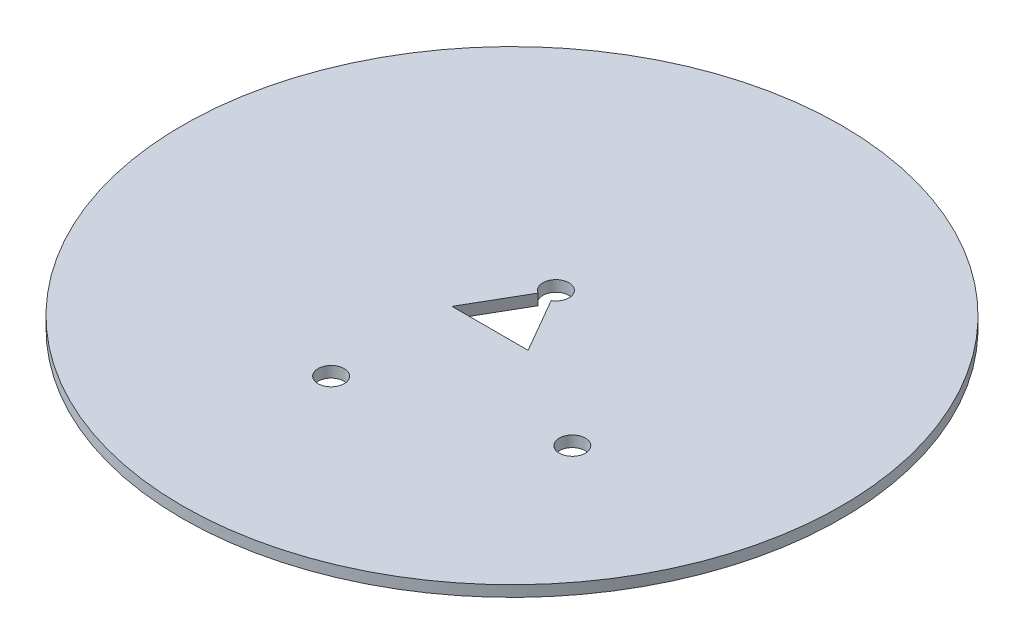
ISO-10303-21;
HEADER;
FILE_DESCRIPTION(('STEP AP214'),'2;1');
FILE_NAME('part.step','',(''),(''),'','','');
FILE_SCHEMA(('AUTOMOTIVE_DESIGN { 1 0 10303 214 1 1 1 1 }'));
ENDSEC;
DATA;
#1=APPLICATION_CONTEXT('core data for automotive mechanical design processes');
#2=APPLICATION_PROTOCOL_DEFINITION('international standard','automotive_design',2000,#1);
#3=PRODUCT_CONTEXT('',#1,'mechanical');
#4=PRODUCT('Part','Part','',(#3));
#5=PRODUCT_RELATED_PRODUCT_CATEGORY('part','',(#4));
#6=PRODUCT_DEFINITION_FORMATION('','',#4);
#7=PRODUCT_DEFINITION_CONTEXT('part definition',#1,'design');
#8=PRODUCT_DEFINITION('design','',#6,#7);
#9=PRODUCT_DEFINITION_SHAPE('','',#8);
#10=(LENGTH_UNIT() NAMED_UNIT(*) SI_UNIT(.MILLI.,.METRE.));
#11=(NAMED_UNIT(*) PLANE_ANGLE_UNIT() SI_UNIT($,.RADIAN.));
#12=(NAMED_UNIT(*) SI_UNIT($,.STERADIAN.) SOLID_ANGLE_UNIT());
#13=UNCERTAINTY_MEASURE_WITH_UNIT(LENGTH_MEASURE(1.E-05),#10,'distance_accuracy_value','');
#14=(GEOMETRIC_REPRESENTATION_CONTEXT(3) GLOBAL_UNCERTAINTY_ASSIGNED_CONTEXT((#13)) GLOBAL_UNIT_ASSIGNED_CONTEXT((#10,
#11,#12)) REPRESENTATION_CONTEXT('',''));
#15=CARTESIAN_POINT('',(0.,0.,0.));
#16=DIRECTION('',(0.,0.,1.));
#17=DIRECTION('',(1.,0.,0.));
#18=AXIS2_PLACEMENT_3D('',#15,#16,#17);
#19=CARTESIAN_POINT('',(0.,10.,-40.0000000000003));
#20=DIRECTION('',(0.,-1.,0.));
#21=DIRECTION('',(0.,0.,-1.));
#22=AXIS2_PLACEMENT_3D('',#19,#20,#21);
#23=CYLINDRICAL_SURFACE('',#22,11.9027637148966);
#24=CARTESIAN_POINT('',(0.,0.,-40.0000000000003));
#25=DIRECTION('',(0.,1.,0.));
#26=DIRECTION('',(0.,0.,1.));
#27=AXIS2_PLACEMENT_3D('',#24,#25,#26);
#28=CIRCLE('',#27,11.9027637148966);
#29=CARTESIAN_POINT('',(5.95138185744826,0.,-29.6919042476563));
#30=VERTEX_POINT('',#29);
#31=CARTESIAN_POINT('',(-5.95138185744829,0.,-29.6919042476563));
#32=VERTEX_POINT('',#31);
#33=EDGE_CURVE('E129',#30,#32,#28,.T.);
#34=ORIENTED_EDGE('',*,*,#33,.F.);
#35=DIRECTION('',(0.,-1.,0.));
#36=VECTOR('',#35,1.);
#37=CARTESIAN_POINT('',(5.95138185744826,10.,-29.6919042476563));
#38=LINE('',#37,#36);
#39=CARTESIAN_POINT('',(5.95138185744826,10.,-29.6919042476563));
#40=VERTEX_POINT('',#39);
#41=EDGE_CURVE('E11',#40,#30,#38,.T.);
#42=ORIENTED_EDGE('',*,*,#41,.F.);
#43=CARTESIAN_POINT('',(0.,10.,-40.0000000000003));
#44=DIRECTION('',(0.,1.,0.));
#45=DIRECTION('',(0.,0.,1.));
#46=AXIS2_PLACEMENT_3D('',#43,#44,#45);
#47=CIRCLE('',#46,11.9027637148966);
#48=CARTESIAN_POINT('',(-5.95138185744829,10.,-29.6919042476563));
#49=VERTEX_POINT('',#48);
#50=EDGE_CURVE('E106',#40,#49,#47,.T.);
#51=ORIENTED_EDGE('',*,*,#50,.T.);
#52=DIRECTION('',(0.,-1.,0.));
#53=VECTOR('',#52,1.);
#54=CARTESIAN_POINT('',(-5.95138185744829,10.,-29.6919042476563));
#55=LINE('',#54,#53);
#56=EDGE_CURVE('E65',#49,#32,#55,.T.);
#57=ORIENTED_EDGE('',*,*,#56,.T.);
#58=EDGE_LOOP('',(#34,#42,#51,#57));
#59=FACE_BOUND('',#58,.T.);
#60=ADVANCED_FACE('F47',(#59),#23,.F.);
#61=CARTESIAN_POINT('',(17.3205080756889,10.,-10.));
#62=DIRECTION('',(-0.86602540378444,0.,0.499999999999998));
#63=DIRECTION('',(0.499999999999998,0.,0.86602540378444));
#64=AXIS2_PLACEMENT_3D('',#61,#62,#63);
#65=PLANE('',#64);
#66=DIRECTION('',(-0.499999999999998,0.,-0.86602540378444));
#67=VECTOR('',#66,1.);
#68=CARTESIAN_POINT('',(17.3205080756889,0.,-10.));
#69=LINE('',#68,#67);
#70=CARTESIAN_POINT('',(34.6410161513776,0.,20.));
#71=VERTEX_POINT('',#70);
#72=EDGE_CURVE('E95',#71,#30,#69,.T.);
#73=ORIENTED_EDGE('',*,*,#72,.F.);
#74=DIRECTION('',(0.,-1.,0.));
#75=VECTOR('',#74,1.);
#76=CARTESIAN_POINT('',(34.6410161513776,10.,20.));
#77=LINE('',#76,#75);
#78=CARTESIAN_POINT('',(34.6410161513776,10.,20.));
#79=VERTEX_POINT('',#78);
#80=EDGE_CURVE('E57',#79,#71,#77,.T.);
#81=ORIENTED_EDGE('',*,*,#80,.F.);
#82=DIRECTION('',(-0.499999999999998,0.,-0.86602540378444));
#83=VECTOR('',#82,1.);
#84=CARTESIAN_POINT('',(17.3205080756889,10.,-10.));
#85=LINE('',#84,#83);
#86=EDGE_CURVE('E93',#79,#40,#85,.T.);
#87=ORIENTED_EDGE('',*,*,#86,.T.);
#88=ORIENTED_EDGE('',*,*,#41,.T.);
#89=EDGE_LOOP('',(#73,#81,#87,#88));
#90=FACE_BOUND('',#89,.T.);
#91=ADVANCED_FACE('F92',(#90),#65,.T.);
#92=CARTESIAN_POINT('',(0.,10.,20.0000000000001));
#93=DIRECTION('',(0.,0.,-1.));
#94=DIRECTION('',(-1.,0.,0.));
#95=AXIS2_PLACEMENT_3D('',#92,#93,#94);
#96=PLANE('',#95);
#97=DIRECTION('',(1.,0.,0.));
#98=VECTOR('',#97,1.);
#99=CARTESIAN_POINT('',(0.,0.,20.0000000000001));
#100=LINE('',#99,#98);
#101=CARTESIAN_POINT('',(-34.6410161513779,0.,20.0000000000002));
#102=VERTEX_POINT('',#101);
#103=EDGE_CURVE('E134',#102,#71,#100,.T.);
#104=ORIENTED_EDGE('',*,*,#103,.F.);
#105=DIRECTION('',(0.,-1.,0.));
#106=VECTOR('',#105,1.);
#107=CARTESIAN_POINT('',(-34.6410161513779,10.,20.0000000000002));
#108=LINE('',#107,#106);
#109=CARTESIAN_POINT('',(-34.6410161513779,10.,20.0000000000002));
#110=VERTEX_POINT('',#109);
#111=EDGE_CURVE('E78',#110,#102,#108,.T.);
#112=ORIENTED_EDGE('',*,*,#111,.F.);
#113=DIRECTION('',(1.,0.,0.));
#114=VECTOR('',#113,1.);
#115=CARTESIAN_POINT('',(0.,10.,20.0000000000001));
#116=LINE('',#115,#114);
#117=EDGE_CURVE('E105',#110,#79,#116,.T.);
#118=ORIENTED_EDGE('',*,*,#117,.T.);
#119=ORIENTED_EDGE('',*,*,#80,.T.);
#120=EDGE_LOOP('',(#104,#112,#118,#119));
#121=FACE_BOUND('',#120,.T.);
#122=ADVANCED_FACE('F109',(#121),#96,.T.);
#123=CARTESIAN_POINT('',(-17.3205080756889,10.,-10.0000000000001));
#124=DIRECTION('',(0.866025403784438,0.,0.5));
#125=DIRECTION('',(0.5,0.,-0.866025403784439));
#126=AXIS2_PLACEMENT_3D('',#123,#124,#125);
#127=PLANE('',#126);
#128=DIRECTION('',(-0.5,0.,0.866025403784439));
#129=VECTOR('',#128,1.);
#130=CARTESIAN_POINT('',(-17.3205080756889,0.,-10.0000000000001));
#131=LINE('',#130,#129);
#132=EDGE_CURVE('E137',#32,#102,#131,.T.);
#133=ORIENTED_EDGE('',*,*,#132,.F.);
#134=ORIENTED_EDGE('',*,*,#56,.F.);
#135=DIRECTION('',(-0.5,0.,0.866025403784439));
#136=VECTOR('',#135,1.);
#137=CARTESIAN_POINT('',(-17.3205080756889,10.,-10.0000000000001));
#138=LINE('',#137,#136);
#139=EDGE_CURVE('E111',#49,#110,#138,.T.);
#140=ORIENTED_EDGE('',*,*,#139,.T.);
#141=ORIENTED_EDGE('',*,*,#111,.T.);
#142=EDGE_LOOP('',(#133,#134,#140,#141));
#143=FACE_BOUND('',#142,.T.);
#144=ADVANCED_FACE('F161',(#143),#127,.T.);
#145=CARTESIAN_POINT('',(129.903810567665,10.,75.0000000000006));
#146=DIRECTION('',(0.,-1.,0.));
#147=DIRECTION('',(0.,0.,-1.));
#148=AXIS2_PLACEMENT_3D('',#145,#146,#147);
#149=CYLINDRICAL_SURFACE('',#148,11.9027637148966);
#150=CARTESIAN_POINT('',(129.903810567665,10.,75.0000000000006));
#151=DIRECTION('',(0.,1.,0.));
#152=DIRECTION('',(0.,0.,1.));
#153=AXIS2_PLACEMENT_3D('',#150,#151,#152);
#154=CIRCLE('',#153,11.9027637148966);
#155=CARTESIAN_POINT('',(129.903810567665,10.,86.9027637148972));
#156=VERTEX_POINT('',#155);
#157=EDGE_CURVE('E153',#156,#156,#154,.T.);
#158=ORIENTED_EDGE('',*,*,#157,.T.);
#159=EDGE_LOOP('',(#158));
#160=FACE_BOUND('',#159,.T.);
#161=CARTESIAN_POINT('',(129.903810567665,0.,75.0000000000006));
#162=DIRECTION('',(0.,1.,0.));
#163=DIRECTION('',(0.,0.,1.));
#164=AXIS2_PLACEMENT_3D('',#161,#162,#163);
#165=CIRCLE('',#164,11.9027637148966);
#166=CARTESIAN_POINT('',(129.903810567665,0.,86.9027637148972));
#167=VERTEX_POINT('',#166);
#168=EDGE_CURVE('E125',#167,#167,#165,.T.);
#169=ORIENTED_EDGE('',*,*,#168,.F.);
#170=EDGE_LOOP('',(#169));
#171=FACE_BOUND('',#170,.T.);
#172=ADVANCED_FACE('F163',(#160,#171),#149,.F.);
#173=CARTESIAN_POINT('',(-34.6410161513786,10.,130.));
#174=DIRECTION('',(0.,-1.,0.));
#175=DIRECTION('',(0.,0.,-1.));
#176=AXIS2_PLACEMENT_3D('',#173,#174,#175);
#177=CYLINDRICAL_SURFACE('',#176,11.9027637148966);
#178=CARTESIAN_POINT('',(-34.6410161513786,10.,130.));
#179=DIRECTION('',(0.,1.,0.));
#180=DIRECTION('',(0.,0.,1.));
#181=AXIS2_PLACEMENT_3D('',#178,#179,#180);
#182=CIRCLE('',#181,11.9027637148966);
#183=CARTESIAN_POINT('',(-34.6410161513786,10.,141.902763714896));
#184=VERTEX_POINT('',#183);
#185=EDGE_CURVE('E145',#184,#184,#182,.T.);
#186=ORIENTED_EDGE('',*,*,#185,.T.);
#187=EDGE_LOOP('',(#186));
#188=FACE_BOUND('',#187,.T.);
#189=CARTESIAN_POINT('',(-34.6410161513786,0.,130.));
#190=DIRECTION('',(0.,1.,0.));
#191=DIRECTION('',(0.,0.,1.));
#192=AXIS2_PLACEMENT_3D('',#189,#190,#191);
#193=CIRCLE('',#192,11.9027637148966);
#194=CARTESIAN_POINT('',(-34.6410161513786,0.,141.902763714896));
#195=VERTEX_POINT('',#194);
#196=EDGE_CURVE('E121',#195,#195,#193,.T.);
#197=ORIENTED_EDGE('',*,*,#196,.F.);
#198=EDGE_LOOP('',(#197));
#199=FACE_BOUND('',#198,.T.);
#200=ADVANCED_FACE('F49',(#188,#199),#177,.F.);
#201=CARTESIAN_POINT('',(0.,10.,0.));
#202=DIRECTION('',(0.,-1.,0.));
#203=DIRECTION('',(0.,0.,-1.));
#204=AXIS2_PLACEMENT_3D('',#201,#202,#203);
#205=CYLINDRICAL_SURFACE('',#204,300.);
#206=CARTESIAN_POINT('',(0.,10.,0.));
#207=DIRECTION('',(0.,1.,0.));
#208=DIRECTION('',(0.,0.,1.));
#209=AXIS2_PLACEMENT_3D('',#206,#207,#208);
#210=CIRCLE('',#209,300.);
#211=CARTESIAN_POINT('',(0.,10.,300.));
#212=VERTEX_POINT('',#211);
#213=EDGE_CURVE('E114',#212,#212,#210,.T.);
#214=ORIENTED_EDGE('',*,*,#213,.F.);
#215=EDGE_LOOP('',(#214));
#216=FACE_BOUND('',#215,.T.);
#217=CARTESIAN_POINT('',(0.,0.,0.));
#218=DIRECTION('',(0.,1.,0.));
#219=DIRECTION('',(0.,0.,1.));
#220=AXIS2_PLACEMENT_3D('',#217,#218,#219);
#221=CIRCLE('',#220,300.);
#222=CARTESIAN_POINT('',(0.,0.,300.));
#223=VERTEX_POINT('',#222);
#224=EDGE_CURVE('E141',#223,#223,#221,.T.);
#225=ORIENTED_EDGE('',*,*,#224,.T.);
#226=EDGE_LOOP('',(#225));
#227=FACE_BOUND('',#226,.T.);
#228=ADVANCED_FACE('F205',(#216,#227),#205,.T.);
#229=CARTESIAN_POINT('',(0.,10.,0.));
#230=DIRECTION('',(0.,1.,0.));
#231=DIRECTION('',(0.,0.,1.));
#232=AXIS2_PLACEMENT_3D('',#229,#230,#231);
#233=PLANE('',#232);
#234=ORIENTED_EDGE('',*,*,#185,.F.);
#235=EDGE_LOOP('',(#234));
#236=FACE_BOUND('',#235,.T.);
#237=ORIENTED_EDGE('',*,*,#157,.F.);
#238=EDGE_LOOP('',(#237));
#239=FACE_BOUND('',#238,.T.);
#240=ORIENTED_EDGE('',*,*,#50,.F.);
#241=ORIENTED_EDGE('',*,*,#86,.F.);
#242=ORIENTED_EDGE('',*,*,#117,.F.);
#243=ORIENTED_EDGE('',*,*,#139,.F.);
#244=EDGE_LOOP('',(#240,#241,#242,#243));
#245=FACE_BOUND('',#244,.T.);
#246=ORIENTED_EDGE('',*,*,#213,.T.);
#247=EDGE_LOOP('',(#246));
#248=FACE_BOUND('',#247,.T.);
#249=ADVANCED_FACE('F102',(#236,#239,#245,#248),#233,.T.);
#250=CARTESIAN_POINT('',(0.,0.,0.));
#251=DIRECTION('',(0.,1.,0.));
#252=DIRECTION('',(0.,0.,1.));
#253=AXIS2_PLACEMENT_3D('',#250,#251,#252);
#254=PLANE('',#253);
#255=ORIENTED_EDGE('',*,*,#196,.T.);
#256=EDGE_LOOP('',(#255));
#257=FACE_BOUND('',#256,.T.);
#258=ORIENTED_EDGE('',*,*,#168,.T.);
#259=EDGE_LOOP('',(#258));
#260=FACE_BOUND('',#259,.T.);
#261=ORIENTED_EDGE('',*,*,#33,.T.);
#262=ORIENTED_EDGE('',*,*,#132,.T.);
#263=ORIENTED_EDGE('',*,*,#103,.T.);
#264=ORIENTED_EDGE('',*,*,#72,.T.);
#265=EDGE_LOOP('',(#261,#262,#263,#264));
#266=FACE_BOUND('',#265,.T.);
#267=ORIENTED_EDGE('',*,*,#224,.F.);
#268=EDGE_LOOP('',(#267));
#269=FACE_BOUND('',#268,.T.);
#270=ADVANCED_FACE('F221',(#257,#260,#266,#269),#254,.F.);
#271=CLOSED_SHELL('',(#60,#91,#122,#144,#172,#200,#228,#249,#270));
#272=MANIFOLD_SOLID_BREP('B2',#271);
#273=ADVANCED_BREP_SHAPE_REPRESENTATION('',(#18,#272),#14);
#274=SHAPE_DEFINITION_REPRESENTATION(#9,#273);
ENDSEC;
END-ISO-10303-21;
